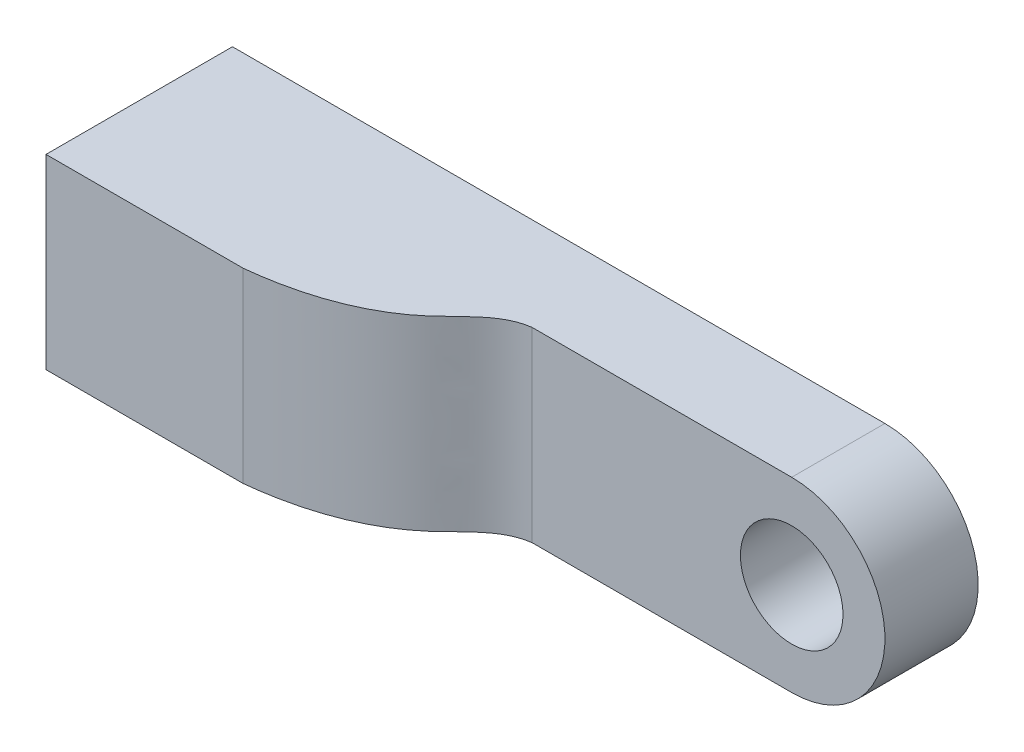
ISO-10303-21;
HEADER;
FILE_DESCRIPTION(('STEP AP214'),'2;1');
FILE_NAME('part.step','',(''),(''),'','','');
FILE_SCHEMA(('AUTOMOTIVE_DESIGN { 1 0 10303 214 1 1 1 1 }'));
ENDSEC;
DATA;
#1=APPLICATION_CONTEXT('core data for automotive mechanical design processes');
#2=APPLICATION_PROTOCOL_DEFINITION('international standard','automotive_design',2000,#1);
#3=PRODUCT_CONTEXT('',#1,'mechanical');
#4=PRODUCT('Part','Part','',(#3));
#5=PRODUCT_RELATED_PRODUCT_CATEGORY('part','',(#4));
#6=PRODUCT_DEFINITION_FORMATION('','',#4);
#7=PRODUCT_DEFINITION_CONTEXT('part definition',#1,'design');
#8=PRODUCT_DEFINITION('design','',#6,#7);
#9=PRODUCT_DEFINITION_SHAPE('','',#8);
#10=(LENGTH_UNIT() NAMED_UNIT(*) SI_UNIT(.MILLI.,.METRE.));
#11=(NAMED_UNIT(*) PLANE_ANGLE_UNIT() SI_UNIT($,.RADIAN.));
#12=(NAMED_UNIT(*) SI_UNIT($,.STERADIAN.) SOLID_ANGLE_UNIT());
#13=UNCERTAINTY_MEASURE_WITH_UNIT(LENGTH_MEASURE(1.E-05),#10,'distance_accuracy_value','');
#14=(GEOMETRIC_REPRESENTATION_CONTEXT(3) GLOBAL_UNCERTAINTY_ASSIGNED_CONTEXT((#13)) GLOBAL_UNIT_ASSIGNED_CONTEXT((#10,
#11,#12)) REPRESENTATION_CONTEXT('',''));
#15=CARTESIAN_POINT('',(0.,0.,0.));
#16=DIRECTION('',(0.,0.,1.));
#17=DIRECTION('',(1.,0.,0.));
#18=AXIS2_PLACEMENT_3D('',#15,#16,#17);
#19=CARTESIAN_POINT('',(5.99845876905954,-0.145714285714277,4.));
#20=DIRECTION('',(0.,0.,-1.));
#21=DIRECTION('',(-1.,0.,0.));
#22=AXIS2_PLACEMENT_3D('',#19,#20,#21);
#23=PLANE('',#22);
#24=DIRECTION('',(1.,0.,0.));
#25=VECTOR('',#24,1.);
#26=CARTESIAN_POINT('',(-7.99845876905954,-2.14571428571428,4.));
#27=LINE('',#26,#25);
#28=CARTESIAN_POINT('',(-7.99845876905954,-2.14571428571428,4.));
#29=VERTEX_POINT('',#28);
#30=CARTESIAN_POINT('',(-3.76740072393567,-2.14571428571428,4.));
#31=VERTEX_POINT('',#30);
#32=EDGE_CURVE('E98',#29,#31,#27,.T.);
#33=ORIENTED_EDGE('',*,*,#32,.T.);
#34=DIRECTION('',(0.,1.,0.));
#35=VECTOR('',#34,1.);
#36=CARTESIAN_POINT('',(-3.76740072393567,-3.14571428571428,4.));
#37=LINE('',#36,#35);
#38=CARTESIAN_POINT('',(-3.76740072393567,1.85428571428572,4.));
#39=VERTEX_POINT('',#38);
#40=EDGE_CURVE('E140',#31,#39,#37,.T.);
#41=ORIENTED_EDGE('',*,*,#40,.T.);
#42=DIRECTION('',(-1.,0.,0.));
#43=VECTOR('',#42,1.);
#44=CARTESIAN_POINT('',(5.99845876905954,1.85428571428572,4.));
#45=LINE('',#44,#43);
#46=CARTESIAN_POINT('',(-7.99845876905954,1.85428571428572,4.));
#47=VERTEX_POINT('',#46);
#48=EDGE_CURVE('E108',#39,#47,#45,.T.);
#49=ORIENTED_EDGE('',*,*,#48,.T.);
#50=DIRECTION('',(0.,-1.,0.));
#51=VECTOR('',#50,1.);
#52=CARTESIAN_POINT('',(-7.99845876905954,1.85428571428572,4.));
#53=LINE('',#52,#51);
#54=EDGE_CURVE('E66',#47,#29,#53,.T.);
#55=ORIENTED_EDGE('',*,*,#54,.T.);
#56=EDGE_LOOP('',(#33,#41,#49,#55));
#57=FACE_BOUND('',#56,.T.);
#58=ADVANCED_FACE('F39',(#57),#23,.F.);
#59=CARTESIAN_POINT('',(5.99845876905954,-0.145714285714277,0.));
#60=DIRECTION('',(0.,0.,-1.));
#61=DIRECTION('',(-1.,0.,0.));
#62=AXIS2_PLACEMENT_3D('',#59,#60,#61);
#63=PLANE('',#62);
#64=CARTESIAN_POINT('',(5.99845876905954,-0.145714285714277,0.));
#65=DIRECTION('',(0.,0.,1.));
#66=DIRECTION('',(-1.,0.,0.));
#67=AXIS2_PLACEMENT_3D('',#64,#65,#66);
#68=CIRCLE('',#67,2.);
#69=CARTESIAN_POINT('',(5.99845876905954,-2.14571428571428,0.));
#70=VERTEX_POINT('',#69);
#71=CARTESIAN_POINT('',(5.99845876905954,1.85428571428572,0.));
#72=VERTEX_POINT('',#71);
#73=EDGE_CURVE('E90',#70,#72,#68,.T.);
#74=ORIENTED_EDGE('',*,*,#73,.F.);
#75=DIRECTION('',(1.,0.,0.));
#76=VECTOR('',#75,1.);
#77=CARTESIAN_POINT('',(-7.99845876905954,-2.14571428571428,0.));
#78=LINE('',#77,#76);
#79=CARTESIAN_POINT('',(-7.99845876905954,-2.14571428571428,0.));
#80=VERTEX_POINT('',#79);
#81=EDGE_CURVE('E102',#80,#70,#78,.T.);
#82=ORIENTED_EDGE('',*,*,#81,.F.);
#83=DIRECTION('',(0.,-1.,0.));
#84=VECTOR('',#83,1.);
#85=CARTESIAN_POINT('',(-7.99845876905954,1.85428571428572,0.));
#86=LINE('',#85,#84);
#87=CARTESIAN_POINT('',(-7.99845876905954,1.85428571428572,0.));
#88=VERTEX_POINT('',#87);
#89=EDGE_CURVE('E109',#88,#80,#86,.T.);
#90=ORIENTED_EDGE('',*,*,#89,.F.);
#91=DIRECTION('',(-1.,0.,0.));
#92=VECTOR('',#91,1.);
#93=CARTESIAN_POINT('',(5.99845876905954,1.85428571428572,0.));
#94=LINE('',#93,#92);
#95=EDGE_CURVE('E114',#72,#88,#94,.T.);
#96=ORIENTED_EDGE('',*,*,#95,.F.);
#97=EDGE_LOOP('',(#74,#82,#90,#96));
#98=FACE_BOUND('',#97,.T.);
#99=CARTESIAN_POINT('',(5.99845895565287,-0.145714127872972,0.));
#100=DIRECTION('',(0.,0.,1.));
#101=DIRECTION('',(1.,0.,0.));
#102=AXIS2_PLACEMENT_3D('',#99,#100,#101);
#103=CIRCLE('',#102,1.10000002394491);
#104=CARTESIAN_POINT('',(7.09845897959778,-0.145714127872972,0.));
#105=VERTEX_POINT('',#104);
#106=EDGE_CURVE('E116',#105,#105,#103,.T.);
#107=ORIENTED_EDGE('',*,*,#106,.T.);
#108=EDGE_LOOP('',(#107));
#109=FACE_BOUND('',#108,.T.);
#110=ADVANCED_FACE('F112',(#98,#109),#63,.T.);
#111=CARTESIAN_POINT('',(5.99845876905954,-0.145714285714277,4.));
#112=DIRECTION('',(0.,0.,-1.));
#113=DIRECTION('',(-1.,0.,0.));
#114=AXIS2_PLACEMENT_3D('',#111,#112,#113);
#115=CYLINDRICAL_SURFACE('',#114,2.);
#116=DIRECTION('',(0.,0.,-1.));
#117=VECTOR('',#116,1.);
#118=CARTESIAN_POINT('',(5.99845876905954,1.85428571428572,4.));
#119=LINE('',#118,#117);
#120=CARTESIAN_POINT('',(5.99845876905954,1.85428571428572,2.));
#121=VERTEX_POINT('',#120);
#122=EDGE_CURVE('E50',#121,#72,#119,.T.);
#123=ORIENTED_EDGE('',*,*,#122,.F.);
#124=CARTESIAN_POINT('',(5.99845876905954,-0.145714285714277,2.));
#125=DIRECTION('',(0.,0.,-1.));
#126=DIRECTION('',(-1.,0.,0.));
#127=AXIS2_PLACEMENT_3D('',#124,#125,#126);
#128=CIRCLE('',#127,2.);
#129=CARTESIAN_POINT('',(5.99845876905954,-2.14571428571428,2.));
#130=VERTEX_POINT('',#129);
#131=EDGE_CURVE('E93',#121,#130,#128,.T.);
#132=ORIENTED_EDGE('',*,*,#131,.T.);
#133=DIRECTION('',(0.,0.,-1.));
#134=VECTOR('',#133,1.);
#135=CARTESIAN_POINT('',(5.99845876905954,-2.14571428571428,4.));
#136=LINE('',#135,#134);
#137=EDGE_CURVE('E86',#130,#70,#136,.T.);
#138=ORIENTED_EDGE('',*,*,#137,.T.);
#139=ORIENTED_EDGE('',*,*,#73,.T.);
#140=EDGE_LOOP('',(#123,#132,#138,#139));
#141=FACE_BOUND('',#140,.T.);
#142=ADVANCED_FACE('F41',(#141),#115,.T.);
#143=CARTESIAN_POINT('',(5.99845876905954,1.85428571428572,4.));
#144=DIRECTION('',(0.,-1.,0.));
#145=DIRECTION('',(1.,0.,0.));
#146=AXIS2_PLACEMENT_3D('',#143,#144,#145);
#147=PLANE('',#146);
#148=ORIENTED_EDGE('',*,*,#48,.F.);
#149=CARTESIAN_POINT('',(0.430237449437598,1.85428571428572,2.));
#150=CARTESIAN_POINT('',(-0.148462867184894,1.85428571428572,2.07720275641717));
#151=CARTESIAN_POINT('',(-1.12311709143882,1.85428571428572,3.42900615792334));
#152=CARTESIAN_POINT('',(-2.75616394707759,1.85428571428572,3.89178359235276));
#153=CARTESIAN_POINT('',(-3.76740072393567,1.85428571428572,4.));
#154=B_SPLINE_CURVE_WITH_KNOTS('',3,(#149,#150,#151,#152,#153),.UNSPECIFIED.,.F.,.F.,(4,1,4),
(0.,0.343240431785464,1.),.UNSPECIFIED.);
#155=CARTESIAN_POINT('',(0.430237449437598,1.85428571428572,2.));
#156=VERTEX_POINT('',#155);
#157=EDGE_CURVE('E152',#156,#39,#154,.T.);
#158=ORIENTED_EDGE('',*,*,#157,.F.);
#159=DIRECTION('',(-1.,0.,0.));
#160=VECTOR('',#159,1.);
#161=CARTESIAN_POINT('',(0.430237449437598,1.85428571428572,2.));
#162=LINE('',#161,#160);
#163=EDGE_CURVE('E181',#121,#156,#162,.T.);
#164=ORIENTED_EDGE('',*,*,#163,.F.);
#165=ORIENTED_EDGE('',*,*,#122,.T.);
#166=ORIENTED_EDGE('',*,*,#95,.T.);
#167=DIRECTION('',(0.,0.,-1.));
#168=VECTOR('',#167,1.);
#169=CARTESIAN_POINT('',(-7.99845876905954,1.85428571428572,4.));
#170=LINE('',#169,#168);
#171=EDGE_CURVE('E131',#47,#88,#170,.T.);
#172=ORIENTED_EDGE('',*,*,#171,.F.);
#173=EDGE_LOOP('',(#148,#158,#164,#165,#166,#172));
#174=FACE_BOUND('',#173,.T.);
#175=ADVANCED_FACE('F216',(#174),#147,.F.);
#176=CARTESIAN_POINT('',(-7.99845876905954,1.85428571428572,4.));
#177=DIRECTION('',(1.,0.,0.));
#178=DIRECTION('',(0.,0.,-1.));
#179=AXIS2_PLACEMENT_3D('',#176,#177,#178);
#180=PLANE('',#179);
#181=CARTESIAN_POINT('',(-7.99845876905954,-0.145714285714277,2.));
#182=DIRECTION('',(-1.,0.,0.));
#183=DIRECTION('',(0.,0.,1.));
#184=AXIS2_PLACEMENT_3D('',#181,#182,#183);
#185=CIRCLE('',#184,1.);
#186=CARTESIAN_POINT('',(-7.99845876905954,-0.145714285714277,3.));
#187=VERTEX_POINT('',#186);
#188=EDGE_CURVE('E161',#187,#187,#185,.T.);
#189=ORIENTED_EDGE('',*,*,#188,.F.);
#190=EDGE_LOOP('',(#189));
#191=FACE_BOUND('',#190,.T.);
#192=ORIENTED_EDGE('',*,*,#89,.T.);
#193=DIRECTION('',(0.,0.,-1.));
#194=VECTOR('',#193,1.);
#195=CARTESIAN_POINT('',(-7.99845876905954,-2.14571428571428,4.));
#196=LINE('',#195,#194);
#197=EDGE_CURVE('E97',#29,#80,#196,.T.);
#198=ORIENTED_EDGE('',*,*,#197,.F.);
#199=ORIENTED_EDGE('',*,*,#54,.F.);
#200=ORIENTED_EDGE('',*,*,#171,.T.);
#201=EDGE_LOOP('',(#192,#198,#199,#200));
#202=FACE_BOUND('',#201,.T.);
#203=ADVANCED_FACE('F214',(#191,#202),#180,.F.);
#204=CARTESIAN_POINT('',(-7.99845876905954,-2.14571428571428,4.));
#205=DIRECTION('',(0.,1.,0.));
#206=DIRECTION('',(0.,0.,1.));
#207=AXIS2_PLACEMENT_3D('',#204,#205,#206);
#208=PLANE('',#207);
#209=DIRECTION('',(-1.,0.,0.));
#210=VECTOR('',#209,1.);
#211=CARTESIAN_POINT('',(-7.99845876905954,-2.14571428571428,2.));
#212=LINE('',#211,#210);
#213=CARTESIAN_POINT('',(0.430237449437598,-2.14571428571428,2.));
#214=VERTEX_POINT('',#213);
#215=EDGE_CURVE('E139',#130,#214,#212,.T.);
#216=ORIENTED_EDGE('',*,*,#215,.T.);
#217=CARTESIAN_POINT('',(0.430237449437598,-2.14571428571428,2.));
#218=CARTESIAN_POINT('',(-0.148462867184894,-2.14571428571428,2.07720275641717));
#219=CARTESIAN_POINT('',(-1.12311709143882,-2.14571428571428,3.42900615792334));
#220=CARTESIAN_POINT('',(-2.75616394707759,-2.14571428571428,3.89178359235276));
#221=CARTESIAN_POINT('',(-3.76740072393567,-2.14571428571428,4.));
#222=B_SPLINE_CURVE_WITH_KNOTS('',3,(#217,#218,#219,#220,#221),.UNSPECIFIED.,.F.,.F.,(4,1,4),
(0.,0.343240431785464,1.),.UNSPECIFIED.);
#223=EDGE_CURVE('E11',#214,#31,#222,.T.);
#224=ORIENTED_EDGE('',*,*,#223,.T.);
#225=ORIENTED_EDGE('',*,*,#32,.F.);
#226=ORIENTED_EDGE('',*,*,#197,.T.);
#227=ORIENTED_EDGE('',*,*,#81,.T.);
#228=ORIENTED_EDGE('',*,*,#137,.F.);
#229=EDGE_LOOP('',(#216,#224,#225,#226,#227,#228));
#230=FACE_BOUND('',#229,.T.);
#231=ADVANCED_FACE('F103',(#230),#208,.F.);
#232=CARTESIAN_POINT('',(5.99845895565287,-0.145714127872972,4.));
#233=DIRECTION('',(0.,0.,-1.));
#234=DIRECTION('',(-1.,0.,0.));
#235=AXIS2_PLACEMENT_3D('',#232,#233,#234);
#236=CYLINDRICAL_SURFACE('',#235,1.10000002394491);
#237=CARTESIAN_POINT('',(5.99845895565287,-0.145714127872972,2.));
#238=DIRECTION('',(0.,0.,-1.));
#239=DIRECTION('',(-1.,0.,0.));
#240=AXIS2_PLACEMENT_3D('',#237,#238,#239);
#241=CIRCLE('',#240,1.10000002394491);
#242=CARTESIAN_POINT('',(4.89845893170796,-0.145714127872972,2.));
#243=VERTEX_POINT('',#242);
#244=EDGE_CURVE('E136',#243,#243,#241,.T.);
#245=ORIENTED_EDGE('',*,*,#244,.F.);
#246=EDGE_LOOP('',(#245));
#247=FACE_BOUND('',#246,.T.);
#248=ORIENTED_EDGE('',*,*,#106,.F.);
#249=EDGE_LOOP('',(#248));
#250=FACE_BOUND('',#249,.T.);
#251=ADVANCED_FACE('F203',(#247,#250),#236,.F.);
#252=CARTESIAN_POINT('',(-2.99845876905954,-0.145714285714277,2.));
#253=DIRECTION('',(-1.,0.,0.));
#254=DIRECTION('',(0.,0.,1.));
#255=AXIS2_PLACEMENT_3D('',#252,#253,#254);
#256=CYLINDRICAL_SURFACE('',#255,1.);
#257=CARTESIAN_POINT('',(-2.99845876905954,-0.145714285714277,2.));
#258=DIRECTION('',(-1.,0.,0.));
#259=DIRECTION('',(0.,0.,1.));
#260=AXIS2_PLACEMENT_3D('',#257,#258,#259);
#261=CIRCLE('',#260,1.);
#262=CARTESIAN_POINT('',(-2.99845876905954,-0.145714285714277,3.));
#263=VERTEX_POINT('',#262);
#264=EDGE_CURVE('E122',#263,#263,#261,.T.);
#265=ORIENTED_EDGE('',*,*,#264,.F.);
#266=EDGE_LOOP('',(#265));
#267=FACE_BOUND('',#266,.T.);
#268=ORIENTED_EDGE('',*,*,#188,.T.);
#269=EDGE_LOOP('',(#268));
#270=FACE_BOUND('',#269,.T.);
#271=ADVANCED_FACE('F199',(#267,#270),#256,.F.);
#272=CARTESIAN_POINT('',(-2.99845876905954,-0.145714285714277,2.));
#273=DIRECTION('',(-1.,0.,0.));
#274=DIRECTION('',(0.,0.,1.));
#275=AXIS2_PLACEMENT_3D('',#272,#273,#274);
#276=PLANE('',#275);
#277=ORIENTED_EDGE('',*,*,#264,.T.);
#278=EDGE_LOOP('',(#277));
#279=FACE_BOUND('',#278,.T.);
#280=ADVANCED_FACE('F194',(#279),#276,.T.);
#281=CARTESIAN_POINT('',(0.430237449437599,-3.14571428571428,2.));
#282=CARTESIAN_POINT('',(-0.148462867184894,-3.14571428571428,2.07720275641717));
#283=CARTESIAN_POINT('',(-1.12311709143882,-3.14571428571428,3.42900615792334));
#284=CARTESIAN_POINT('',(-2.75616394707759,-3.14571428571428,3.89178359235276));
#285=CARTESIAN_POINT('',(-3.76740072393567,-3.14571428571428,4.));
#286=B_SPLINE_CURVE_WITH_KNOTS('',3,(#281,#282,#283,#284,#285),.UNSPECIFIED.,.F.,.F.,(4,1,4),
(0.,0.343240431785464,1.),.UNSPECIFIED.);
#287=DIRECTION('',(0.,1.,0.));
#288=VECTOR('',#287,1.);
#289=SURFACE_OF_LINEAR_EXTRUSION('',#286,#288);
#290=DIRECTION('',(0.,1.,0.));
#291=VECTOR('',#290,1.);
#292=CARTESIAN_POINT('',(0.430237449437599,-3.14571428571428,2.));
#293=LINE('',#292,#291);
#294=EDGE_CURVE('E57',#214,#156,#293,.T.);
#295=ORIENTED_EDGE('',*,*,#294,.T.);
#296=ORIENTED_EDGE('',*,*,#157,.T.);
#297=ORIENTED_EDGE('',*,*,#40,.F.);
#298=ORIENTED_EDGE('',*,*,#223,.F.);
#299=EDGE_LOOP('',(#295,#296,#297,#298));
#300=FACE_BOUND('',#299,.T.);
#301=ADVANCED_FACE('F172',(#300),#289,.F.);
#302=CARTESIAN_POINT('',(0.430237449437599,-3.14571428571428,2.));
#303=DIRECTION('',(0.,0.,-1.));
#304=DIRECTION('',(-1.,0.,0.));
#305=AXIS2_PLACEMENT_3D('',#302,#303,#304);
#306=PLANE('',#305);
#307=ORIENTED_EDGE('',*,*,#244,.T.);
#308=EDGE_LOOP('',(#307));
#309=FACE_BOUND('',#308,.T.);
#310=ORIENTED_EDGE('',*,*,#163,.T.);
#311=ORIENTED_EDGE('',*,*,#294,.F.);
#312=ORIENTED_EDGE('',*,*,#215,.F.);
#313=ORIENTED_EDGE('',*,*,#131,.F.);
#314=EDGE_LOOP('',(#310,#311,#312,#313));
#315=FACE_BOUND('',#314,.T.);
#316=ADVANCED_FACE('F193',(#309,#315),#306,.F.);
#317=CLOSED_SHELL('',(#58,#110,#142,#175,#203,#231,#251,#271,#280,#301,#316));
#318=MANIFOLD_SOLID_BREP('B2',#317);
#319=ADVANCED_BREP_SHAPE_REPRESENTATION('',(#18,#318),#14);
#320=SHAPE_DEFINITION_REPRESENTATION(#9,#319);
ENDSEC;
END-ISO-10303-21;
